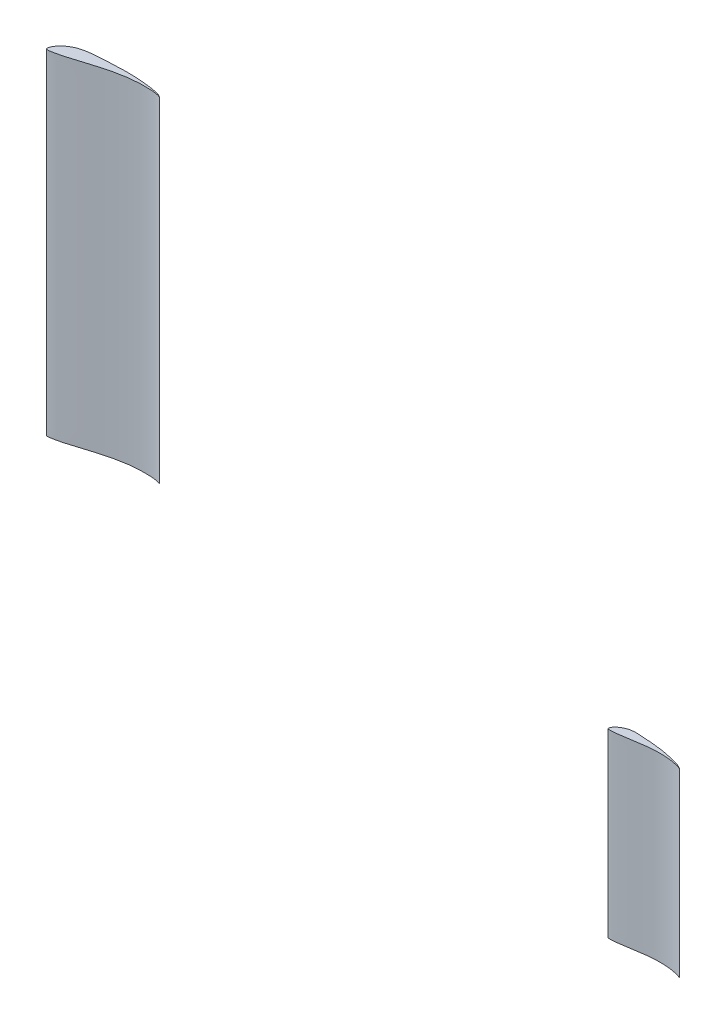
ISO-10303-21;
HEADER;
FILE_DESCRIPTION(('STEP AP214'),'2;1');
FILE_NAME('part.step','',(''),(''),'','','');
FILE_SCHEMA(('AUTOMOTIVE_DESIGN { 1 0 10303 214 1 1 1 1 }'));
ENDSEC;
DATA;
#1=APPLICATION_CONTEXT('core data for automotive mechanical design processes');
#2=APPLICATION_PROTOCOL_DEFINITION('international standard','automotive_design',2000,#1);
#3=PRODUCT_CONTEXT('',#1,'mechanical');
#4=PRODUCT('Part','Part','',(#3));
#5=PRODUCT_RELATED_PRODUCT_CATEGORY('part','',(#4));
#6=PRODUCT_DEFINITION_FORMATION('','',#4);
#7=PRODUCT_DEFINITION_CONTEXT('part definition',#1,'design');
#8=PRODUCT_DEFINITION('design','',#6,#7);
#9=PRODUCT_DEFINITION_SHAPE('','',#8);
#10=(LENGTH_UNIT() NAMED_UNIT(*) SI_UNIT(.MILLI.,.METRE.));
#11=(NAMED_UNIT(*) PLANE_ANGLE_UNIT() SI_UNIT($,.RADIAN.));
#12=(NAMED_UNIT(*) SI_UNIT($,.STERADIAN.) SOLID_ANGLE_UNIT());
#13=UNCERTAINTY_MEASURE_WITH_UNIT(LENGTH_MEASURE(1.E-05),#10,'distance_accuracy_value','');
#14=(GEOMETRIC_REPRESENTATION_CONTEXT(3) GLOBAL_UNCERTAINTY_ASSIGNED_CONTEXT((#13)) GLOBAL_UNIT_ASSIGNED_CONTEXT((#10,
#11,#12)) REPRESENTATION_CONTEXT('',''));
#15=CARTESIAN_POINT('',(0.,0.,0.));
#16=DIRECTION('',(0.,0.,1.));
#17=DIRECTION('',(1.,0.,0.));
#18=AXIS2_PLACEMENT_3D('',#15,#16,#17);
#19=CARTESIAN_POINT('',(116.3516619177,-918.5408,21.9189464425538));
#20=CARTESIAN_POINT('',(114.880184889703,-918.5408,21.0513955649698));
#21=CARTESIAN_POINT('',(111.896966515149,-918.5408,19.7634625530697));
#22=CARTESIAN_POINT('',(105.899493320042,-918.5408,18.0877520815689));
#23=CARTESIAN_POINT('',(99.2779101525673,-918.5408,16.8610794453423));
#24=CARTESIAN_POINT('',(91.8821248813582,-918.5408,15.9272126304989));
#25=CARTESIAN_POINT('',(85.1587141829066,-918.5408,15.4115044888699));
#26=CARTESIAN_POINT('',(79.4860854225937,-918.5408,15.2472375023575));
#27=CARTESIAN_POINT('',(73.7572898443164,-918.5408,15.2809957102243));
#28=CARTESIAN_POINT('',(67.9491375578998,-918.5408,15.5131422806831));
#29=CARTESIAN_POINT('',(60.8862013528964,-918.5408,16.088065969334));
#30=CARTESIAN_POINT('',(53.663256951299,-918.5408,16.9328211919334));
#31=CARTESIAN_POINT('',(46.2416865829394,-918.5408,18.0024021110677));
#32=CARTESIAN_POINT('',(38.6227301872935,-918.5408,19.2296057071137));
#33=CARTESIAN_POINT('',(30.9464756680591,-918.5408,20.513045031962));
#34=CARTESIAN_POINT('',(23.5183278239467,-918.5408,21.7421494799793));
#35=CARTESIAN_POINT('',(16.7160753691253,-918.5408,22.7460618734126));
#36=CARTESIAN_POINT('',(11.036474358905,-918.5408,23.3038674921176));
#37=CARTESIAN_POINT('',(6.79257736681524,-918.5408,23.5997933354412));
#38=CARTESIAN_POINT('',(3.93381333631442,-918.5408,23.70435563002));
#39=CARTESIAN_POINT('',(2.03104589424141,-918.5408,23.6865001551765));
#40=CARTESIAN_POINT('',(0.672135996375437,-918.5408,23.5836291146071));
#41=CARTESIAN_POINT('',(-0.251459105050463,-918.5408,23.3918159262408));
#42=CARTESIAN_POINT('',(-0.79910638337308,-918.5408,23.0392427234967));
#43=CARTESIAN_POINT('',(-1.04746286171829,-918.5408,22.6630039735577));
#44=CARTESIAN_POINT('',(-1.14311175008061,-918.5408,22.2399081484101));
#45=CARTESIAN_POINT('',(-1.1554295588922,-918.5408,21.8056293884727));
#46=CARTESIAN_POINT('',(-1.11182031736378,-918.5408,21.3547078834418));
#47=CARTESIAN_POINT('',(-1.01659251445665,-918.5408,20.8781407083978));
#48=CARTESIAN_POINT('',(-0.743303767346034,-918.5408,19.9420243573031));
#49=CARTESIAN_POINT('',(-0.143494311790179,-918.5408,18.6912000756194));
#50=CARTESIAN_POINT('',(0.934270449146839,-918.5408,17.0846285931195));
#51=CARTESIAN_POINT('',(2.42341596695299,-918.5408,15.3768725307792));
#52=CARTESIAN_POINT('',(4.58539962891674,-918.5408,13.4075758923394));
#53=CARTESIAN_POINT('',(8.06773418293157,-918.5408,10.8345933451955));
#54=CARTESIAN_POINT('',(13.1328595075379,-918.5408,8.16878249802561));
#55=CARTESIAN_POINT('',(19.0813984271983,-918.5408,6.43110759588909));
#56=CARTESIAN_POINT('',(26.0121028067134,-918.5408,5.52412685296481));
#57=CARTESIAN_POINT('',(33.0392553479574,-918.5408,5.60244891411294));
#58=CARTESIAN_POINT('',(42.2018388075658,-918.5408,6.20171971488515));
#59=CARTESIAN_POINT('',(52.2455637723253,-918.5408,7.01636466180608));
#60=CARTESIAN_POINT('',(62.3729670463216,-918.5408,7.8918172880272));
#61=CARTESIAN_POINT('',(71.0106031543367,-918.5408,8.88372714189937));
#62=CARTESIAN_POINT('',(78.1790010911814,-918.5408,9.94949021972461));
#63=CARTESIAN_POINT('',(85.2566663712182,-918.5408,11.2600320016349));
#64=CARTESIAN_POINT('',(92.2322482512784,-918.5408,12.7847026246824));
#65=CARTESIAN_POINT('',(99.757411497397,-918.5408,14.6547401871146));
#66=CARTESIAN_POINT('',(106.269293715959,-918.5408,16.5774639183494));
#67=CARTESIAN_POINT('',(111.882790128821,-918.5408,18.6952726257081));
#68=CARTESIAN_POINT('',(114.445989053191,-918.5408,20.2761996932254));
#69=CARTESIAN_POINT('',(115.597743986299,-918.5408,21.310792136838));
#70=B_SPLINE_CURVE_WITH_KNOTS('',3,(#19,#20,#21,#22,#23,#24,#25,#26,#27,#28,#29,#30,#31,#32,#33,
#34,#35,#36,#37,#38,#39,#40,#41,#42,#43,#44,#45,#46,#47,#48,#49,#50,#51,#52,#53,#54,#55,#56,#57,
#58,#59,#60,#61,#62,#63,#64,#65,#66,#67,#68,#69),.UNSPECIFIED.,.F.,.F.,(4,1,1,1,1,1,1,1,1,1,1,1,
1,1,1,1,1,1,1,1,1,1,1,1,1,1,1,1,1,1,1,1,1,1,1,1,1,1,1,1,1,1,1,1,1,1,1,1,4),(0.,
0.0208716463675834,0.0395476339725527,0.0760656332794006,0.103114670998977,0.130696635402942,
0.158500061673762,0.172493943787943,0.200757557069287,0.229566347120827,0.25914002050728,
0.289682929524816,0.321264162263145,0.353520759751669,0.384867079137399,0.413350462450784,
0.437592090619532,0.454645107039914,0.465368773934857,0.472581538532757,0.477882719006693,
0.482075328983476,0.483926496235703,0.485692370565855,0.487431313835688,0.489165798788122,
0.490990683428529,0.492960160238372,0.495101109652517,0.50290524380074,0.509787509366333,
0.518724914191796,0.530539461060546,0.545488516752679,0.57158481708503,0.600076375768395,
0.620781294957303,0.65688817944315,0.685769596136234,0.733118574106906,0.780110270302389,
0.810088044178571,0.839436836578545,0.868726230244041,0.898103174144103,0.926750672615363,
0.963546234738279,0.981096451493884,1.),.UNSPECIFIED.);
#71=DIRECTION('',(0.,1.,0.));
#72=VECTOR('',#71,1.);
#73=SURFACE_OF_LINEAR_EXTRUSION('',#70,#72);
#74=CARTESIAN_POINT('',(116.3516619177,-618.5408,21.9189464425538));
#75=CARTESIAN_POINT('',(114.880184889703,-618.5408,21.0513955649698));
#76=CARTESIAN_POINT('',(111.896966515149,-618.5408,19.7634625530697));
#77=CARTESIAN_POINT('',(105.899493320042,-618.5408,18.0877520815689));
#78=CARTESIAN_POINT('',(99.2779101525673,-618.5408,16.8610794453423));
#79=CARTESIAN_POINT('',(91.8821248813582,-618.5408,15.9272126304989));
#80=CARTESIAN_POINT('',(85.1587141829066,-618.5408,15.4115044888699));
#81=CARTESIAN_POINT('',(79.4860854225937,-618.5408,15.2472375023575));
#82=CARTESIAN_POINT('',(73.7572898443164,-618.5408,15.2809957102243));
#83=CARTESIAN_POINT('',(67.9491375578998,-618.5408,15.5131422806831));
#84=CARTESIAN_POINT('',(60.8862013528964,-618.5408,16.088065969334));
#85=CARTESIAN_POINT('',(53.663256951299,-618.5408,16.9328211919334));
#86=CARTESIAN_POINT('',(46.2416865829394,-618.5408,18.0024021110677));
#87=CARTESIAN_POINT('',(38.6227301872935,-618.5408,19.2296057071137));
#88=CARTESIAN_POINT('',(30.9464756680591,-618.5408,20.513045031962));
#89=CARTESIAN_POINT('',(23.5183278239467,-618.5408,21.7421494799793));
#90=CARTESIAN_POINT('',(16.7160753691253,-618.5408,22.7460618734126));
#91=CARTESIAN_POINT('',(11.036474358905,-618.5408,23.3038674921176));
#92=CARTESIAN_POINT('',(6.79257736681524,-618.5408,23.5997933354412));
#93=CARTESIAN_POINT('',(3.93381333631442,-618.5408,23.70435563002));
#94=CARTESIAN_POINT('',(2.03104589424141,-618.5408,23.6865001551765));
#95=CARTESIAN_POINT('',(0.672135996375437,-618.5408,23.5836291146071));
#96=CARTESIAN_POINT('',(-0.251459105050463,-618.5408,23.3918159262408));
#97=CARTESIAN_POINT('',(-0.79910638337308,-618.5408,23.0392427234967));
#98=CARTESIAN_POINT('',(-1.04746286171829,-618.5408,22.6630039735577));
#99=CARTESIAN_POINT('',(-1.14311175008061,-618.5408,22.2399081484101));
#100=CARTESIAN_POINT('',(-1.1554295588922,-618.5408,21.8056293884727));
#101=CARTESIAN_POINT('',(-1.11182031736378,-618.5408,21.3547078834418));
#102=CARTESIAN_POINT('',(-1.01659251445665,-618.5408,20.8781407083978));
#103=CARTESIAN_POINT('',(-0.743303767346034,-618.5408,19.9420243573031));
#104=CARTESIAN_POINT('',(-0.143494311790179,-618.5408,18.6912000756194));
#105=CARTESIAN_POINT('',(0.934270449146839,-618.5408,17.0846285931195));
#106=CARTESIAN_POINT('',(2.42341596695299,-618.5408,15.3768725307792));
#107=CARTESIAN_POINT('',(4.58539962891674,-618.5408,13.4075758923394));
#108=CARTESIAN_POINT('',(8.06773418293157,-618.5408,10.8345933451955));
#109=CARTESIAN_POINT('',(13.1328595075379,-618.5408,8.16878249802561));
#110=CARTESIAN_POINT('',(19.0813984271983,-618.5408,6.43110759588909));
#111=CARTESIAN_POINT('',(26.0121028067134,-618.5408,5.52412685296481));
#112=CARTESIAN_POINT('',(33.0392553479574,-618.5408,5.60244891411294));
#113=CARTESIAN_POINT('',(42.2018388075658,-618.5408,6.20171971488515));
#114=CARTESIAN_POINT('',(52.2455637723253,-618.5408,7.01636466180608));
#115=CARTESIAN_POINT('',(62.3729670463216,-618.5408,7.8918172880272));
#116=CARTESIAN_POINT('',(71.0106031543367,-618.5408,8.88372714189937));
#117=CARTESIAN_POINT('',(78.1790010911814,-618.5408,9.94949021972461));
#118=CARTESIAN_POINT('',(85.2566663712182,-618.5408,11.2600320016349));
#119=CARTESIAN_POINT('',(92.2322482512784,-618.5408,12.7847026246824));
#120=CARTESIAN_POINT('',(99.757411497397,-618.5408,14.6547401871146));
#121=CARTESIAN_POINT('',(106.269293715959,-618.5408,16.5774639183494));
#122=CARTESIAN_POINT('',(111.882790128821,-618.5408,18.6952726257081));
#123=CARTESIAN_POINT('',(114.445989053191,-618.5408,20.2761996932254));
#124=CARTESIAN_POINT('',(115.597743986299,-618.5408,21.310792136838));
#125=B_SPLINE_CURVE_WITH_KNOTS('',3,(#74,#75,#76,#77,#78,#79,#80,#81,#82,#83,#84,#85,#86,#87,
#88,#89,#90,#91,#92,#93,#94,#95,#96,#97,#98,#99,#100,#101,#102,#103,#104,#105,#106,#107,#108,
#109,#110,#111,#112,#113,#114,#115,#116,#117,#118,#119,#120,#121,#122,#123,#124),.UNSPECIFIED.,
.F.,.F.,(4,1,1,1,1,1,1,1,1,1,1,1,1,1,1,1,1,1,1,1,1,1,1,1,1,1,1,1,1,1,1,1,1,1,1,1,1,1,1,1,1,1,1,
1,1,1,1,1,4),(0.,0.0208716463675834,0.0395476339725527,0.0760656332794006,0.103114670998977,
0.130696635402942,0.158500061673762,0.172493943787943,0.200757557069287,0.229566347120827,
0.25914002050728,0.289682929524816,0.321264162263145,0.353520759751669,0.384867079137399,
0.413350462450784,0.437592090619532,0.454645107039914,0.465368773934857,0.472581538532757,
0.477882719006693,0.482075328983476,0.483926496235703,0.485692370565855,0.487431313835688,
0.489165798788122,0.490990683428529,0.492960160238372,0.495101109652517,0.50290524380074,
0.509787509366333,0.518724914191796,0.530539461060546,0.545488516752679,0.57158481708503,
0.600076375768395,0.620781294957303,0.65688817944315,0.685769596136234,0.733118574106906,
0.780110270302389,0.810088044178571,0.839436836578545,0.868726230244041,0.898103174144103,
0.926750672615363,0.963546234738279,0.981096451493884,1.),.UNSPECIFIED.);
#126=CARTESIAN_POINT('',(116.3516619177,-618.5408,21.9189464425538));
#127=VERTEX_POINT('',#126);
#128=CARTESIAN_POINT('',(115.597743986299,-618.5408,21.310792136838));
#129=VERTEX_POINT('',#128);
#130=EDGE_CURVE('E85',#127,#129,#125,.T.);
#131=ORIENTED_EDGE('',*,*,#130,.T.);
#132=DIRECTION('',(0.,1.,0.));
#133=VECTOR('',#132,1.);
#134=CARTESIAN_POINT('',(115.597743986299,-918.5408,21.310792136838));
#135=LINE('',#134,#133);
#136=CARTESIAN_POINT('',(115.597743986299,-918.5408,21.310792136838));
#137=VERTEX_POINT('',#136);
#138=EDGE_CURVE('E12',#137,#129,#135,.T.);
#139=ORIENTED_EDGE('',*,*,#138,.F.);
#140=CARTESIAN_POINT('',(116.3516619177,-918.5408,21.9189464425538));
#141=VERTEX_POINT('',#140);
#142=EDGE_CURVE('E84',#141,#137,#70,.T.);
#143=ORIENTED_EDGE('',*,*,#142,.F.);
#144=DIRECTION('',(0.,1.,0.));
#145=VECTOR('',#144,1.);
#146=CARTESIAN_POINT('',(116.3516619177,-918.5408,21.9189464425538));
#147=LINE('',#146,#145);
#148=EDGE_CURVE('E61',#141,#127,#147,.T.);
#149=ORIENTED_EDGE('',*,*,#148,.T.);
#150=EDGE_LOOP('',(#131,#139,#143,#149));
#151=FACE_BOUND('',#150,.T.);
#152=ADVANCED_FACE('F51',(#151),#73,.F.);
#153=CARTESIAN_POINT('',(115.597743986299,-918.5408,21.310792136838));
#154=DIRECTION('',(-0.627850015824503,0.,0.7783343482265));
#155=DIRECTION('',(0.7783343482265,0.,0.627850015824503));
#156=AXIS2_PLACEMENT_3D('',#153,#154,#155);
#157=PLANE('',#156);
#158=DIRECTION('',(0.7783343482265,0.,0.627850015824503));
#159=VECTOR('',#158,1.);
#160=CARTESIAN_POINT('',(115.597743986299,-618.5408,21.310792136838));
#161=LINE('',#160,#159);
#162=EDGE_CURVE('E76',#129,#127,#161,.T.);
#163=ORIENTED_EDGE('',*,*,#162,.T.);
#164=ORIENTED_EDGE('',*,*,#148,.F.);
#165=DIRECTION('',(0.7783343482265,0.,0.627850015824503));
#166=VECTOR('',#165,1.);
#167=CARTESIAN_POINT('',(115.597743986299,-918.5408,21.310792136838));
#168=LINE('',#167,#166);
#169=EDGE_CURVE('E68',#137,#141,#168,.T.);
#170=ORIENTED_EDGE('',*,*,#169,.F.);
#171=ORIENTED_EDGE('',*,*,#138,.T.);
#172=EDGE_LOOP('',(#163,#164,#170,#171));
#173=FACE_BOUND('',#172,.T.);
#174=ADVANCED_FACE('F79',(#173),#157,.F.);
#175=CARTESIAN_POINT('',(-0.407056742759811,-918.5408,19.2783677336266));
#176=DIRECTION('',(0.,-1.,0.));
#177=DIRECTION('',(0.,0.,-1.));
#178=AXIS2_PLACEMENT_3D('',#175,#176,#177);
#179=PLANE('',#178);
#180=ORIENTED_EDGE('',*,*,#142,.T.);
#181=ORIENTED_EDGE('',*,*,#169,.T.);
#182=EDGE_LOOP('',(#180,#181));
#183=FACE_BOUND('',#182,.T.);
#184=ADVANCED_FACE('F106',(#183),#179,.T.);
#185=CARTESIAN_POINT('',(-0.407056742759811,-618.5408,19.2783677336266));
#186=DIRECTION('',(0.,-1.,0.));
#187=DIRECTION('',(0.,0.,-1.));
#188=AXIS2_PLACEMENT_3D('',#185,#186,#187);
#189=PLANE('',#188);
#190=ORIENTED_EDGE('',*,*,#130,.F.);
#191=ORIENTED_EDGE('',*,*,#162,.F.);
#192=EDGE_LOOP('',(#190,#191));
#193=FACE_BOUND('',#192,.T.);
#194=ADVANCED_FACE('F89',(#193),#189,.F.);
#195=CLOSED_SHELL('',(#152,#174,#184,#194));
#196=MANIFOLD_SOLID_BREP('B2',#195);
#197=CARTESIAN_POINT('',(-725.232005900612,-785.534765274392,42.6884161941347));
#198=CARTESIAN_POINT('',(-727.036218364816,-785.534765274392,41.4753212818194));
#199=CARTESIAN_POINT('',(-730.910132067294,-785.534765274392,39.7789447396716));
#200=CARTESIAN_POINT('',(-739.130824574747,-785.534765274392,37.9334006965905));
#201=CARTESIAN_POINT('',(-748.562571729332,-785.534765274392,36.5350832876033));
#202=CARTESIAN_POINT('',(-759.393031348702,-785.534765274392,35.4084802173417));
#203=CARTESIAN_POINT('',(-769.391623437418,-785.534765274392,34.6544962018745));
#204=CARTESIAN_POINT('',(-779.490231823967,-785.534765274392,34.2182648319036));
#205=CARTESIAN_POINT('',(-789.667069815507,-785.534765274392,34.1401836298722));
#206=CARTESIAN_POINT('',(-801.872511812556,-785.534765274392,34.4525500126577));
#207=CARTESIAN_POINT('',(-816.126760688043,-785.534765274392,35.2186281286603));
#208=CARTESIAN_POINT('',(-830.252740435159,-785.534765274392,36.0528747681058));
#209=CARTESIAN_POINT('',(-843.111256475848,-785.534765274392,37.0140413090448));
#210=CARTESIAN_POINT('',(-852.89829371161,-785.534765274392,38.2813961019106));
#211=CARTESIAN_POINT('',(-862.358242333232,-785.534765274392,40.8999871005879));
#212=CARTESIAN_POINT('',(-870.289736768556,-785.534765274392,44.4813536819578));
#213=CARTESIAN_POINT('',(-876.811013744657,-785.534765274392,49.1803353166436));
#214=CARTESIAN_POINT('',(-881.14950094433,-785.534765274392,53.4402440730428));
#215=CARTESIAN_POINT('',(-883.770188905609,-785.534765274392,56.6020990971234));
#216=CARTESIAN_POINT('',(-885.506475755533,-785.534765274392,59.2684902613746));
#217=CARTESIAN_POINT('',(-886.690528753662,-785.534765274392,61.713609052659));
#218=CARTESIAN_POINT('',(-887.279627843367,-785.534765274392,63.5704315119528));
#219=CARTESIAN_POINT('',(-887.476314828863,-785.534765274392,64.9256837656737));
#220=CARTESIAN_POINT('',(-887.515399487498,-785.534765274392,65.6070307640272));
#221=CARTESIAN_POINT('',(-887.487727987646,-785.534765274392,66.2426063583081));
#222=CARTESIAN_POINT('',(-887.385545883035,-785.534765274392,66.8440858654512));
#223=CARTESIAN_POINT('',(-887.169676843473,-785.534765274392,67.4136944211653));
#224=CARTESIAN_POINT('',(-886.750635238794,-785.534765274392,67.8882375110244));
#225=CARTESIAN_POINT('',(-885.920045833492,-785.534765274392,68.2712561192898));
#226=CARTESIAN_POINT('',(-884.598162138856,-785.534765274392,68.3570984970222));
#227=CARTESIAN_POINT('',(-882.688365125981,-785.534765274392,68.2340048967418));
#228=CARTESIAN_POINT('',(-880.038950252391,-785.534765274392,67.8861774005184));
#229=CARTESIAN_POINT('',(-876.084137453227,-785.534765274392,67.1808885332251));
#230=CARTESIAN_POINT('',(-870.240688611537,-785.534765274392,65.9382185687938));
#231=CARTESIAN_POINT('',(-862.452092080598,-785.534765274392,64.0502059237948));
#232=CARTESIAN_POINT('',(-853.189747990739,-785.534765274392,61.3219826506363));
#233=CARTESIAN_POINT('',(-843.101160793255,-785.534765274392,58.1580341544818));
#234=CARTESIAN_POINT('',(-832.678207124755,-785.534765274392,54.8699379452));
#235=CARTESIAN_POINT('',(-822.323916345992,-785.534765274392,51.6712628832011));
#236=CARTESIAN_POINT('',(-812.213232888364,-785.534765274392,48.7304300912722));
#237=CARTESIAN_POINT('',(-802.334719266569,-785.534765274392,46.141132439656));
#238=CARTESIAN_POINT('',(-792.625860655634,-785.534765274392,43.9583900945249));
#239=CARTESIAN_POINT('',(-784.594725219132,-785.534765274392,42.4980501079322));
#240=CARTESIAN_POINT('',(-776.635085954984,-785.534765274392,41.3291236222987));
#241=CARTESIAN_POINT('',(-768.714766987835,-785.534765274392,40.4465638935913));
#242=CARTESIAN_POINT('',(-759.264439916602,-785.534765274392,39.8469097579809));
#243=CARTESIAN_POINT('',(-748.797237384759,-785.534765274392,39.6970471371076));
#244=CARTESIAN_POINT('',(-739.349265636967,-785.534765274392,40.1059767804247));
#245=CARTESIAN_POINT('',(-730.681214106729,-785.534765274392,41.2615536193199));
#246=CARTESIAN_POINT('',(-726.280619756686,-785.534765274392,42.4682427540635));
#247=CARTESIAN_POINT('',(-724.06452865764,-785.534765274392,43.386438341589));
#248=B_SPLINE_CURVE_WITH_KNOTS('',3,(#197,#198,#199,#200,#201,#202,#203,#204,#205,#206,#207,
#208,#209,#210,#211,#212,#213,#214,#215,#216,#217,#218,#219,#220,#221,#222,#223,#224,#225,#226,
#227,#228,#229,#230,#231,#232,#233,#234,#235,#236,#237,#238,#239,#240,#241,#242,#243,#244,#245,
#246,#247),.UNSPECIFIED.,.F.,.F.,(4,1,1,1,1,1,1,1,1,1,1,1,1,1,1,1,1,1,1,1,1,1,1,1,1,1,1,1,1,1,1,
1,1,1,1,1,1,1,1,1,1,1,1,1,1,1,1,1,4),(0.,0.018903548506116,0.0364537652617211,0.073249327384637,
0.101896825855897,0.131273769755959,0.160563163421455,0.189911955821429,0.219889729697611,
0.266881425893094,0.314230403863766,0.34311182055685,0.379218705042697,0.399923624231605,
0.42841518291497,0.454511483247321,0.469460538939454,0.481275085808204,0.490212490633667,
0.49709475619926,0.504898890347483,0.507039839761628,0.509009316571471,0.510834201211878,
0.512568686164312,0.514307629434145,0.516073503764297,0.517924671016524,0.522117280993307,
0.527418461467243,0.534631226065143,0.545354892960086,0.562407909380468,0.586649537549216,
0.615132920862601,0.646479240248331,0.678735837736855,0.710317070475184,0.74085997949272,
0.770433652879173,0.799242442930713,0.827506056212057,0.841499938326238,0.869303364597058,
0.896885329001023,0.923934366720599,0.960452366027447,0.979128353632417,1.),.UNSPECIFIED.);
#249=DIRECTION('',(0.,1.,0.));
#250=VECTOR('',#249,1.);
#251=SURFACE_OF_LINEAR_EXTRUSION('',#248,#250);
#252=CARTESIAN_POINT('',(-725.232005900612,-618.5408,42.6884161941347));
#253=CARTESIAN_POINT('',(-727.036218364816,-618.5408,41.4753212818194));
#254=CARTESIAN_POINT('',(-730.910132067294,-618.5408,39.7789447396716));
#255=CARTESIAN_POINT('',(-739.130824574747,-618.5408,37.9334006965905));
#256=CARTESIAN_POINT('',(-748.562571729332,-618.5408,36.5350832876033));
#257=CARTESIAN_POINT('',(-759.393031348702,-618.5408,35.4084802173417));
#258=CARTESIAN_POINT('',(-769.391623437418,-618.5408,34.6544962018745));
#259=CARTESIAN_POINT('',(-779.490231823967,-618.5408,34.2182648319036));
#260=CARTESIAN_POINT('',(-789.667069815507,-618.5408,34.1401836298722));
#261=CARTESIAN_POINT('',(-801.872511812556,-618.5408,34.4525500126577));
#262=CARTESIAN_POINT('',(-816.126760688043,-618.5408,35.2186281286603));
#263=CARTESIAN_POINT('',(-830.252740435159,-618.5408,36.0528747681058));
#264=CARTESIAN_POINT('',(-843.111256475848,-618.5408,37.0140413090448));
#265=CARTESIAN_POINT('',(-852.89829371161,-618.5408,38.2813961019106));
#266=CARTESIAN_POINT('',(-862.358242333232,-618.5408,40.8999871005879));
#267=CARTESIAN_POINT('',(-870.289736768556,-618.5408,44.4813536819578));
#268=CARTESIAN_POINT('',(-876.811013744657,-618.5408,49.1803353166436));
#269=CARTESIAN_POINT('',(-881.14950094433,-618.5408,53.4402440730428));
#270=CARTESIAN_POINT('',(-883.770188905609,-618.5408,56.6020990971234));
#271=CARTESIAN_POINT('',(-885.506475755533,-618.5408,59.2684902613746));
#272=CARTESIAN_POINT('',(-886.690528753662,-618.5408,61.713609052659));
#273=CARTESIAN_POINT('',(-887.279627843367,-618.5408,63.5704315119528));
#274=CARTESIAN_POINT('',(-887.476314828863,-618.5408,64.9256837656737));
#275=CARTESIAN_POINT('',(-887.515399487498,-618.5408,65.6070307640272));
#276=CARTESIAN_POINT('',(-887.487727987646,-618.5408,66.2426063583081));
#277=CARTESIAN_POINT('',(-887.385545883035,-618.5408,66.8440858654512));
#278=CARTESIAN_POINT('',(-887.169676843473,-618.5408,67.4136944211653));
#279=CARTESIAN_POINT('',(-886.750635238794,-618.5408,67.8882375110244));
#280=CARTESIAN_POINT('',(-885.920045833492,-618.5408,68.2712561192898));
#281=CARTESIAN_POINT('',(-884.598162138856,-618.5408,68.3570984970222));
#282=CARTESIAN_POINT('',(-882.688365125981,-618.5408,68.2340048967418));
#283=CARTESIAN_POINT('',(-880.038950252391,-618.5408,67.8861774005184));
#284=CARTESIAN_POINT('',(-876.084137453227,-618.5408,67.1808885332251));
#285=CARTESIAN_POINT('',(-870.240688611537,-618.5408,65.9382185687938));
#286=CARTESIAN_POINT('',(-862.452092080598,-618.5408,64.0502059237948));
#287=CARTESIAN_POINT('',(-853.189747990739,-618.5408,61.3219826506363));
#288=CARTESIAN_POINT('',(-843.101160793255,-618.5408,58.1580341544818));
#289=CARTESIAN_POINT('',(-832.678207124755,-618.5408,54.8699379452));
#290=CARTESIAN_POINT('',(-822.323916345992,-618.5408,51.6712628832011));
#291=CARTESIAN_POINT('',(-812.213232888364,-618.5408,48.7304300912722));
#292=CARTESIAN_POINT('',(-802.334719266569,-618.5408,46.141132439656));
#293=CARTESIAN_POINT('',(-792.625860655634,-618.5408,43.9583900945249));
#294=CARTESIAN_POINT('',(-784.594725219132,-618.5408,42.4980501079322));
#295=CARTESIAN_POINT('',(-776.635085954984,-618.5408,41.3291236222987));
#296=CARTESIAN_POINT('',(-768.714766987835,-618.5408,40.4465638935913));
#297=CARTESIAN_POINT('',(-759.264439916602,-618.5408,39.8469097579809));
#298=CARTESIAN_POINT('',(-748.797237384759,-618.5408,39.6970471371076));
#299=CARTESIAN_POINT('',(-739.349265636967,-618.5408,40.1059767804247));
#300=CARTESIAN_POINT('',(-730.681214106729,-618.5408,41.2615536193199));
#301=CARTESIAN_POINT('',(-726.280619756686,-618.5408,42.4682427540635));
#302=CARTESIAN_POINT('',(-724.06452865764,-618.5408,43.386438341589));
#303=B_SPLINE_CURVE_WITH_KNOTS('',3,(#252,#253,#254,#255,#256,#257,#258,#259,#260,#261,#262,
#263,#264,#265,#266,#267,#268,#269,#270,#271,#272,#273,#274,#275,#276,#277,#278,#279,#280,#281,
#282,#283,#284,#285,#286,#287,#288,#289,#290,#291,#292,#293,#294,#295,#296,#297,#298,#299,#300,
#301,#302),.UNSPECIFIED.,.F.,.F.,(4,1,1,1,1,1,1,1,1,1,1,1,1,1,1,1,1,1,1,1,1,1,1,1,1,1,1,1,1,1,1,
1,1,1,1,1,1,1,1,1,1,1,1,1,1,1,1,1,4),(0.,0.018903548506116,0.0364537652617211,0.073249327384637,
0.101896825855897,0.131273769755959,0.160563163421455,0.189911955821429,0.219889729697611,
0.266881425893094,0.314230403863766,0.34311182055685,0.379218705042697,0.399923624231605,
0.42841518291497,0.454511483247321,0.469460538939454,0.481275085808204,0.490212490633667,
0.49709475619926,0.504898890347483,0.507039839761628,0.509009316571471,0.510834201211878,
0.512568686164312,0.514307629434145,0.516073503764297,0.517924671016524,0.522117280993307,
0.527418461467243,0.534631226065143,0.545354892960086,0.562407909380468,0.586649537549216,
0.615132920862601,0.646479240248331,0.678735837736855,0.710317070475184,0.74085997949272,
0.770433652879173,0.799242442930713,0.827506056212057,0.841499938326238,0.869303364597058,
0.896885329001023,0.923934366720599,0.960452366027447,0.979128353632417,1.),.UNSPECIFIED.);
#304=CARTESIAN_POINT('',(-724.06452865764,-618.5408,43.386438341589));
#305=VERTEX_POINT('',#304);
#306=CARTESIAN_POINT('',(-725.232005900612,-618.5408,42.6884161941347));
#307=VERTEX_POINT('',#306);
#308=EDGE_CURVE('E147',#305,#307,#303,.F.);
#309=ORIENTED_EDGE('',*,*,#308,.F.);
#310=DIRECTION('',(0.,1.,0.));
#311=VECTOR('',#310,1.);
#312=CARTESIAN_POINT('',(-724.06452865764,-785.534765274392,43.386438341589));
#313=LINE('',#312,#311);
#314=CARTESIAN_POINT('',(-724.06452865764,-63.5,43.386438341589));
#315=VERTEX_POINT('',#314);
#316=EDGE_CURVE('E163',#305,#315,#313,.T.);
#317=ORIENTED_EDGE('',*,*,#316,.T.);
#318=CARTESIAN_POINT('',(-725.232005900612,-63.5,42.6884161941347));
#319=CARTESIAN_POINT('',(-727.036218364816,-63.5,41.4753212818194));
#320=CARTESIAN_POINT('',(-730.910132067294,-63.5,39.7789447396716));
#321=CARTESIAN_POINT('',(-739.130824574747,-63.5,37.9334006965905));
#322=CARTESIAN_POINT('',(-748.562571729332,-63.5,36.5350832876033));
#323=CARTESIAN_POINT('',(-759.393031348702,-63.5,35.4084802173417));
#324=CARTESIAN_POINT('',(-769.391623437418,-63.5,34.6544962018745));
#325=CARTESIAN_POINT('',(-779.490231823967,-63.5,34.2182648319036));
#326=CARTESIAN_POINT('',(-789.667069815507,-63.5,34.1401836298722));
#327=CARTESIAN_POINT('',(-801.872511812556,-63.5,34.4525500126577));
#328=CARTESIAN_POINT('',(-816.126760688043,-63.5,35.2186281286603));
#329=CARTESIAN_POINT('',(-830.252740435159,-63.5,36.0528747681058));
#330=CARTESIAN_POINT('',(-843.111256475848,-63.5,37.0140413090448));
#331=CARTESIAN_POINT('',(-852.89829371161,-63.5,38.2813961019106));
#332=CARTESIAN_POINT('',(-862.358242333232,-63.5,40.8999871005879));
#333=CARTESIAN_POINT('',(-870.289736768556,-63.5,44.4813536819578));
#334=CARTESIAN_POINT('',(-876.811013744657,-63.5,49.1803353166436));
#335=CARTESIAN_POINT('',(-881.14950094433,-63.5,53.4402440730428));
#336=CARTESIAN_POINT('',(-883.770188905609,-63.5,56.6020990971234));
#337=CARTESIAN_POINT('',(-885.506475755533,-63.5,59.2684902613746));
#338=CARTESIAN_POINT('',(-886.690528753662,-63.5,61.713609052659));
#339=CARTESIAN_POINT('',(-887.279627843367,-63.5,63.5704315119528));
#340=CARTESIAN_POINT('',(-887.476314828863,-63.5,64.9256837656737));
#341=CARTESIAN_POINT('',(-887.515399487498,-63.5,65.6070307640272));
#342=CARTESIAN_POINT('',(-887.487727987646,-63.5,66.2426063583081));
#343=CARTESIAN_POINT('',(-887.385545883035,-63.5,66.8440858654512));
#344=CARTESIAN_POINT('',(-887.169676843473,-63.5,67.4136944211653));
#345=CARTESIAN_POINT('',(-886.750635238794,-63.5,67.8882375110244));
#346=CARTESIAN_POINT('',(-885.920045833492,-63.5,68.2712561192898));
#347=CARTESIAN_POINT('',(-884.598162138856,-63.5,68.3570984970222));
#348=CARTESIAN_POINT('',(-882.688365125981,-63.5,68.2340048967418));
#349=CARTESIAN_POINT('',(-880.038950252391,-63.5,67.8861774005184));
#350=CARTESIAN_POINT('',(-876.084137453227,-63.5,67.1808885332251));
#351=CARTESIAN_POINT('',(-870.240688611537,-63.5,65.9382185687938));
#352=CARTESIAN_POINT('',(-862.452092080598,-63.5,64.0502059237948));
#353=CARTESIAN_POINT('',(-853.189747990739,-63.5,61.3219826506363));
#354=CARTESIAN_POINT('',(-843.101160793255,-63.5,58.1580341544818));
#355=CARTESIAN_POINT('',(-832.678207124755,-63.5,54.8699379452));
#356=CARTESIAN_POINT('',(-822.323916345992,-63.5,51.6712628832011));
#357=CARTESIAN_POINT('',(-812.213232888364,-63.5,48.7304300912722));
#358=CARTESIAN_POINT('',(-802.334719266569,-63.5,46.141132439656));
#359=CARTESIAN_POINT('',(-792.625860655634,-63.5,43.9583900945249));
#360=CARTESIAN_POINT('',(-784.594725219132,-63.5,42.4980501079322));
#361=CARTESIAN_POINT('',(-776.635085954984,-63.5,41.3291236222987));
#362=CARTESIAN_POINT('',(-768.714766987835,-63.5,40.4465638935913));
#363=CARTESIAN_POINT('',(-759.264439916602,-63.5,39.8469097579809));
#364=CARTESIAN_POINT('',(-748.797237384759,-63.5,39.6970471371076));
#365=CARTESIAN_POINT('',(-739.349265636967,-63.5,40.1059767804247));
#366=CARTESIAN_POINT('',(-730.681214106729,-63.5,41.2615536193199));
#367=CARTESIAN_POINT('',(-726.280619756686,-63.5,42.4682427540635));
#368=CARTESIAN_POINT('',(-724.06452865764,-63.5,43.386438341589));
#369=B_SPLINE_CURVE_WITH_KNOTS('',3,(#318,#319,#320,#321,#322,#323,#324,#325,#326,#327,#328,
#329,#330,#331,#332,#333,#334,#335,#336,#337,#338,#339,#340,#341,#342,#343,#344,#345,#346,#347,
#348,#349,#350,#351,#352,#353,#354,#355,#356,#357,#358,#359,#360,#361,#362,#363,#364,#365,#366,
#367,#368),.UNSPECIFIED.,.F.,.F.,(4,1,1,1,1,1,1,1,1,1,1,1,1,1,1,1,1,1,1,1,1,1,1,1,1,1,1,1,1,1,1,
1,1,1,1,1,1,1,1,1,1,1,1,1,1,1,1,1,4),(0.,0.018903548506116,0.0364537652617211,0.073249327384637,
0.101896825855897,0.131273769755959,0.160563163421455,0.189911955821429,0.219889729697611,
0.266881425893094,0.314230403863766,0.34311182055685,0.379218705042697,0.399923624231605,
0.42841518291497,0.454511483247321,0.469460538939454,0.481275085808204,0.490212490633667,
0.49709475619926,0.504898890347483,0.507039839761628,0.509009316571471,0.510834201211878,
0.512568686164312,0.514307629434145,0.516073503764297,0.517924671016524,0.522117280993307,
0.527418461467243,0.534631226065143,0.545354892960086,0.562407909380468,0.586649537549216,
0.615132920862601,0.646479240248331,0.678735837736855,0.710317070475184,0.74085997949272,
0.770433652879173,0.799242442930713,0.827506056212057,0.841499938326238,0.869303364597058,
0.896885329001023,0.923934366720599,0.960452366027447,0.979128353632417,1.),.UNSPECIFIED.);
#370=CARTESIAN_POINT('',(-725.232005900612,-63.5,42.6884161941347));
#371=VERTEX_POINT('',#370);
#372=EDGE_CURVE('E165',#371,#315,#369,.T.);
#373=ORIENTED_EDGE('',*,*,#372,.F.);
#374=DIRECTION('',(0.,1.,0.));
#375=VECTOR('',#374,1.);
#376=CARTESIAN_POINT('',(-725.232005900612,-785.534765274392,42.6884161941347));
#377=LINE('',#376,#375);
#378=EDGE_CURVE('E169',#307,#371,#377,.T.);
#379=ORIENTED_EDGE('',*,*,#378,.F.);
#380=EDGE_LOOP('',(#309,#317,#373,#379));
#381=FACE_BOUND('',#380,.T.);
#382=ADVANCED_FACE('F139',(#381),#251,.T.);
#383=CARTESIAN_POINT('',(-725.232005900612,-785.534765274392,42.6884161941347));
#384=DIRECTION('',(0.513163077220936,0.,-0.858291125537914));
#385=DIRECTION('',(-0.858291125537914,0.,-0.513163077220936));
#386=AXIS2_PLACEMENT_3D('',#383,#384,#385);
#387=PLANE('',#386);
#388=DIRECTION('',(0.858291125537914,0.,0.513163077220936));
#389=VECTOR('',#388,1.);
#390=CARTESIAN_POINT('',(-725.232005900612,-618.5408,42.6884161941347));
#391=LINE('',#390,#389);
#392=EDGE_CURVE('E49',#307,#305,#391,.T.);
#393=ORIENTED_EDGE('',*,*,#392,.F.);
#394=ORIENTED_EDGE('',*,*,#378,.T.);
#395=DIRECTION('',(-0.858291125537914,0.,-0.513163077220936));
#396=VECTOR('',#395,1.);
#397=CARTESIAN_POINT('',(-725.232005900612,-63.5,42.6884161941347));
#398=LINE('',#397,#396);
#399=EDGE_CURVE('E170',#315,#371,#398,.T.);
#400=ORIENTED_EDGE('',*,*,#399,.F.);
#401=ORIENTED_EDGE('',*,*,#316,.F.);
#402=EDGE_LOOP('',(#393,#394,#400,#401));
#403=FACE_BOUND('',#402,.T.);
#404=ADVANCED_FACE('F174',(#403),#387,.T.);
#405=CARTESIAN_POINT('',(-886.942032222552,-63.5,62.5817212897173));
#406=DIRECTION('',(0.,-1.,0.));
#407=DIRECTION('',(0.,0.,-1.));
#408=AXIS2_PLACEMENT_3D('',#405,#406,#407);
#409=PLANE('',#408);
#410=ORIENTED_EDGE('',*,*,#372,.T.);
#411=ORIENTED_EDGE('',*,*,#399,.T.);
#412=EDGE_LOOP('',(#410,#411));
#413=FACE_BOUND('',#412,.T.);
#414=ADVANCED_FACE('F172',(#413),#409,.F.);
#415=CARTESIAN_POINT('',(0.,-618.5408,0.));
#416=DIRECTION('',(0.,1.,0.));
#417=DIRECTION('',(0.,0.,1.));
#418=AXIS2_PLACEMENT_3D('',#415,#416,#417);
#419=PLANE('',#418);
#420=ORIENTED_EDGE('',*,*,#308,.T.);
#421=ORIENTED_EDGE('',*,*,#392,.T.);
#422=EDGE_LOOP('',(#420,#421));
#423=FACE_BOUND('',#422,.T.);
#424=ADVANCED_FACE('F199',(#423),#419,.F.);
#425=CLOSED_SHELL('',(#382,#404,#414,#424));
#426=MANIFOLD_SOLID_BREP('B6_NOT_SHOWN',#425);
#427=ADVANCED_BREP_SHAPE_REPRESENTATION('',(#18,#196,#426),#14);
#428=SHAPE_DEFINITION_REPRESENTATION(#9,#427);
ENDSEC;
END-ISO-10303-21;
